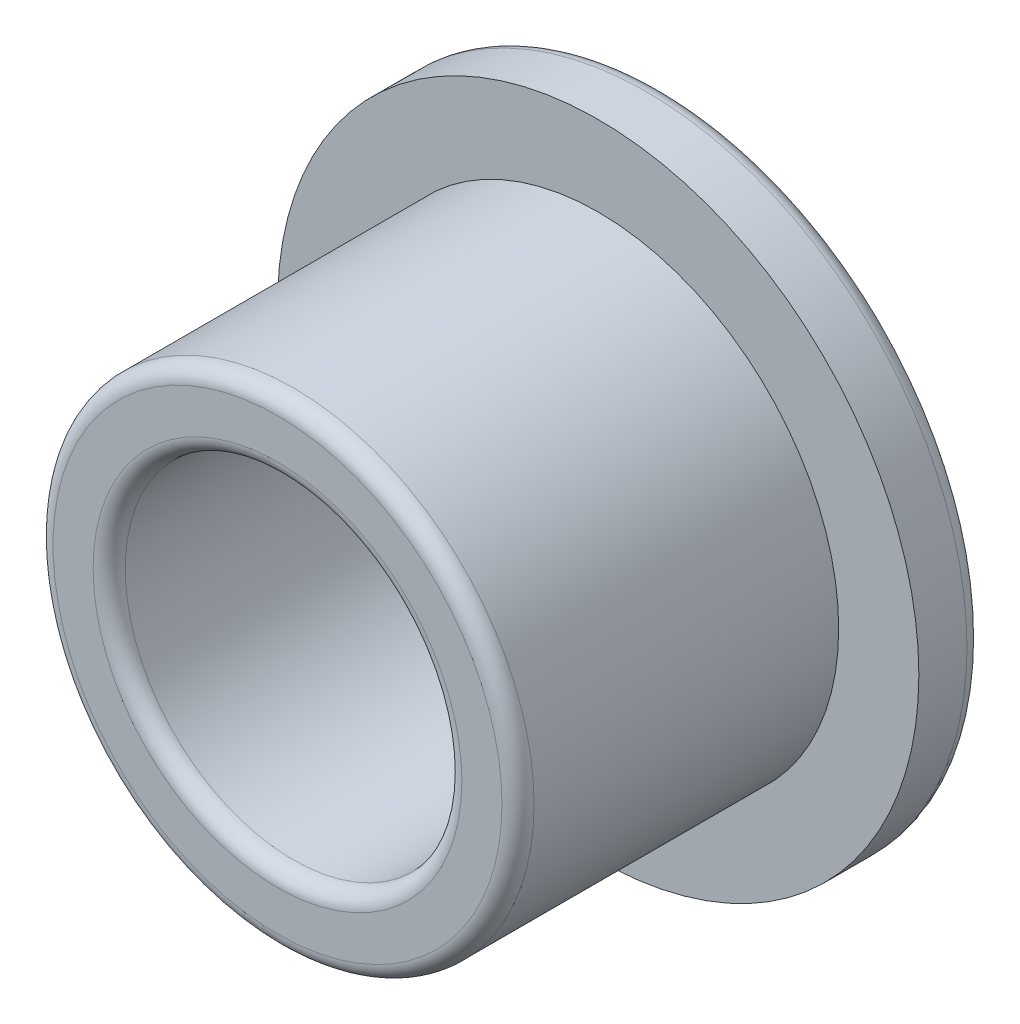
ISO-10303-21;
HEADER;
FILE_DESCRIPTION(('STEP AP214'),'2;1');
FILE_NAME('part.step','',(''),(''),'','','');
FILE_SCHEMA(('AUTOMOTIVE_DESIGN { 1 0 10303 214 1 1 1 1 }'));
ENDSEC;
DATA;
#1=APPLICATION_CONTEXT('core data for automotive mechanical design processes');
#2=APPLICATION_PROTOCOL_DEFINITION('international standard','automotive_design',2000,#1);
#3=PRODUCT_CONTEXT('',#1,'mechanical');
#4=PRODUCT('Part','Part','',(#3));
#5=PRODUCT_RELATED_PRODUCT_CATEGORY('part','',(#4));
#6=PRODUCT_DEFINITION_FORMATION('','',#4);
#7=PRODUCT_DEFINITION_CONTEXT('part definition',#1,'design');
#8=PRODUCT_DEFINITION('design','',#6,#7);
#9=PRODUCT_DEFINITION_SHAPE('','',#8);
#10=(LENGTH_UNIT() NAMED_UNIT(*) SI_UNIT(.MILLI.,.METRE.));
#11=(NAMED_UNIT(*) PLANE_ANGLE_UNIT() SI_UNIT($,.RADIAN.));
#12=(NAMED_UNIT(*) SI_UNIT($,.STERADIAN.) SOLID_ANGLE_UNIT());
#13=UNCERTAINTY_MEASURE_WITH_UNIT(LENGTH_MEASURE(1.E-05),#10,'distance_accuracy_value','');
#14=(GEOMETRIC_REPRESENTATION_CONTEXT(3) GLOBAL_UNCERTAINTY_ASSIGNED_CONTEXT((#13)) GLOBAL_UNIT_ASSIGNED_CONTEXT((#10,
#11,#12)) REPRESENTATION_CONTEXT('',''));
#15=CARTESIAN_POINT('',(0.,0.,0.));
#16=DIRECTION('',(0.,0.,1.));
#17=DIRECTION('',(1.,0.,0.));
#18=AXIS2_PLACEMENT_3D('',#15,#16,#17);
#19=CARTESIAN_POINT('',(0.,0.,10.));
#20=DIRECTION('',(0.,0.,-1.));
#21=DIRECTION('',(-1.,0.,0.));
#22=AXIS2_PLACEMENT_3D('',#19,#20,#21);
#23=CYLINDRICAL_SURFACE('',#22,5.25);
#24=CARTESIAN_POINT('',(0.,0.,9.5));
#25=DIRECTION('',(0.,0.,1.));
#26=DIRECTION('',(1.,0.,0.));
#27=AXIS2_PLACEMENT_3D('',#24,#25,#26);
#28=CIRCLE('',#27,5.25);
#29=CARTESIAN_POINT('',(5.25,0.,9.5));
#30=VERTEX_POINT('',#29);
#31=EDGE_CURVE('E47',#30,#30,#28,.T.);
#32=ORIENTED_EDGE('',*,*,#31,.T.);
#33=EDGE_LOOP('',(#32));
#34=FACE_BOUND('',#33,.T.);
#35=CARTESIAN_POINT('',(0.,0.,-1.5));
#36=DIRECTION('',(0.,0.,1.));
#37=DIRECTION('',(1.,0.,0.));
#38=AXIS2_PLACEMENT_3D('',#35,#36,#37);
#39=CIRCLE('',#38,5.25);
#40=CARTESIAN_POINT('',(5.25,0.,-1.5));
#41=VERTEX_POINT('',#40);
#42=EDGE_CURVE('E52',#41,#41,#39,.F.);
#43=ORIENTED_EDGE('',*,*,#42,.T.);
#44=EDGE_LOOP('',(#43));
#45=FACE_BOUND('',#44,.T.);
#46=ADVANCED_FACE('F32',(#34,#45),#23,.F.);
#47=CARTESIAN_POINT('',(0.,0.,10.));
#48=DIRECTION('',(0.,0.,-1.));
#49=DIRECTION('',(-1.,0.,0.));
#50=AXIS2_PLACEMENT_3D('',#47,#48,#49);
#51=CYLINDRICAL_SURFACE('',#50,7.5);
#52=CARTESIAN_POINT('',(0.,0.,9.5));
#53=DIRECTION('',(0.,0.,1.));
#54=DIRECTION('',(1.,0.,0.));
#55=AXIS2_PLACEMENT_3D('',#52,#53,#54);
#56=CIRCLE('',#55,7.5);
#57=CARTESIAN_POINT('',(7.5,0.,9.5));
#58=VERTEX_POINT('',#57);
#59=EDGE_CURVE('E55',#58,#58,#56,.F.);
#60=ORIENTED_EDGE('',*,*,#59,.T.);
#61=EDGE_LOOP('',(#60));
#62=FACE_BOUND('',#61,.T.);
#63=CARTESIAN_POINT('',(0.,0.,0.));
#64=DIRECTION('',(0.,0.,1.));
#65=DIRECTION('',(1.,0.,0.));
#66=AXIS2_PLACEMENT_3D('',#63,#64,#65);
#67=CIRCLE('',#66,7.5);
#68=CARTESIAN_POINT('',(7.5,0.,0.));
#69=VERTEX_POINT('',#68);
#70=EDGE_CURVE('E64',#69,#69,#67,.T.);
#71=ORIENTED_EDGE('',*,*,#70,.T.);
#72=EDGE_LOOP('',(#71));
#73=FACE_BOUND('',#72,.T.);
#74=ADVANCED_FACE('F83',(#62,#73),#51,.T.);
#75=CARTESIAN_POINT('',(0.,0.,10.));
#76=DIRECTION('',(0.,0.,1.));
#77=DIRECTION('',(1.,0.,0.));
#78=AXIS2_PLACEMENT_3D('',#75,#76,#77);
#79=PLANE('',#78);
#80=CARTESIAN_POINT('',(0.,0.,10.));
#81=DIRECTION('',(0.,0.,1.));
#82=DIRECTION('',(1.,0.,0.));
#83=AXIS2_PLACEMENT_3D('',#80,#81,#82);
#84=CIRCLE('',#83,7.);
#85=CARTESIAN_POINT('',(7.,0.,10.));
#86=VERTEX_POINT('',#85);
#87=EDGE_CURVE('E58',#86,#86,#84,.T.);
#88=ORIENTED_EDGE('',*,*,#87,.T.);
#89=EDGE_LOOP('',(#88));
#90=FACE_BOUND('',#89,.T.);
#91=CARTESIAN_POINT('',(0.,0.,10.));
#92=DIRECTION('',(0.,0.,1.));
#93=DIRECTION('',(1.,0.,0.));
#94=AXIS2_PLACEMENT_3D('',#91,#92,#93);
#95=CIRCLE('',#94,5.75);
#96=CARTESIAN_POINT('',(5.75,0.,10.));
#97=VERTEX_POINT('',#96);
#98=EDGE_CURVE('E61',#97,#97,#95,.F.);
#99=ORIENTED_EDGE('',*,*,#98,.T.);
#100=EDGE_LOOP('',(#99));
#101=FACE_BOUND('',#100,.T.);
#102=ADVANCED_FACE('F76',(#90,#101),#79,.T.);
#103=CARTESIAN_POINT('',(0.,0.,-2.));
#104=DIRECTION('',(0.,0.,1.));
#105=DIRECTION('',(1.,0.,0.));
#106=AXIS2_PLACEMENT_3D('',#103,#104,#105);
#107=CYLINDRICAL_SURFACE('',#106,10.);
#108=CARTESIAN_POINT('',(0.,0.,-1.5));
#109=DIRECTION('',(0.,0.,1.));
#110=DIRECTION('',(1.,0.,0.));
#111=AXIS2_PLACEMENT_3D('',#108,#109,#110);
#112=CIRCLE('',#111,10.);
#113=CARTESIAN_POINT('',(10.,0.,-1.5));
#114=VERTEX_POINT('',#113);
#115=EDGE_CURVE('E10',#114,#114,#112,.T.);
#116=ORIENTED_EDGE('',*,*,#115,.T.);
#117=EDGE_LOOP('',(#116));
#118=FACE_BOUND('',#117,.T.);
#119=CARTESIAN_POINT('',(0.,0.,0.));
#120=DIRECTION('',(0.,0.,1.));
#121=DIRECTION('',(1.,0.,0.));
#122=AXIS2_PLACEMENT_3D('',#119,#120,#121);
#123=CIRCLE('',#122,10.);
#124=CARTESIAN_POINT('',(10.,0.,0.));
#125=VERTEX_POINT('',#124);
#126=EDGE_CURVE('E67',#125,#125,#123,.T.);
#127=ORIENTED_EDGE('',*,*,#126,.F.);
#128=EDGE_LOOP('',(#127));
#129=FACE_BOUND('',#128,.T.);
#130=ADVANCED_FACE('F73',(#118,#129),#107,.T.);
#131=CARTESIAN_POINT('',(0.,0.,-2.));
#132=DIRECTION('',(0.,0.,1.));
#133=DIRECTION('',(1.,0.,0.));
#134=AXIS2_PLACEMENT_3D('',#131,#132,#133);
#135=PLANE('',#134);
#136=CARTESIAN_POINT('',(0.,0.,-2.));
#137=DIRECTION('',(0.,0.,1.));
#138=DIRECTION('',(1.,0.,0.));
#139=AXIS2_PLACEMENT_3D('',#136,#137,#138);
#140=CIRCLE('',#139,5.75);
#141=CARTESIAN_POINT('',(5.75,0.,-2.));
#142=VERTEX_POINT('',#141);
#143=EDGE_CURVE('E39',#142,#142,#140,.T.);
#144=ORIENTED_EDGE('',*,*,#143,.T.);
#145=EDGE_LOOP('',(#144));
#146=FACE_BOUND('',#145,.T.);
#147=CARTESIAN_POINT('',(0.,0.,-2.));
#148=DIRECTION('',(0.,0.,1.));
#149=DIRECTION('',(1.,0.,0.));
#150=AXIS2_PLACEMENT_3D('',#147,#148,#149);
#151=CIRCLE('',#150,9.5);
#152=CARTESIAN_POINT('',(9.5,0.,-2.));
#153=VERTEX_POINT('',#152);
#154=EDGE_CURVE('E43',#153,#153,#151,.F.);
#155=ORIENTED_EDGE('',*,*,#154,.T.);
#156=EDGE_LOOP('',(#155));
#157=FACE_BOUND('',#156,.T.);
#158=ADVANCED_FACE('F75',(#146,#157),#135,.F.);
#159=CARTESIAN_POINT('',(0.,0.,0.));
#160=DIRECTION('',(0.,0.,1.));
#161=DIRECTION('',(1.,0.,0.));
#162=AXIS2_PLACEMENT_3D('',#159,#160,#161);
#163=PLANE('',#162);
#164=ORIENTED_EDGE('',*,*,#70,.F.);
#165=EDGE_LOOP('',(#164));
#166=FACE_BOUND('',#165,.T.);
#167=ORIENTED_EDGE('',*,*,#126,.T.);
#168=EDGE_LOOP('',(#167));
#169=FACE_BOUND('',#168,.T.);
#170=ADVANCED_FACE('F71',(#166,#169),#163,.T.);
#171=CARTESIAN_POINT('',(0.,0.,9.5));
#172=DIRECTION('',(0.,0.,1.));
#173=DIRECTION('',(1.,0.,0.));
#174=AXIS2_PLACEMENT_3D('',#171,#172,#173);
#175=TOROIDAL_SURFACE('',#174,7.,0.5);
#176=ORIENTED_EDGE('',*,*,#59,.F.);
#177=EDGE_LOOP('',(#176));
#178=FACE_BOUND('',#177,.T.);
#179=ORIENTED_EDGE('',*,*,#87,.F.);
#180=EDGE_LOOP('',(#179));
#181=FACE_BOUND('',#180,.T.);
#182=ADVANCED_FACE('F97',(#178,#181),#175,.T.);
#183=CARTESIAN_POINT('',(0.,0.,9.5));
#184=DIRECTION('',(0.,0.,1.));
#185=DIRECTION('',(1.,0.,0.));
#186=AXIS2_PLACEMENT_3D('',#183,#184,#185);
#187=TOROIDAL_SURFACE('',#186,5.75,0.5);
#188=ORIENTED_EDGE('',*,*,#98,.F.);
#189=EDGE_LOOP('',(#188));
#190=FACE_BOUND('',#189,.T.);
#191=ORIENTED_EDGE('',*,*,#31,.F.);
#192=EDGE_LOOP('',(#191));
#193=FACE_BOUND('',#192,.T.);
#194=ADVANCED_FACE('F100',(#190,#193),#187,.T.);
#195=CARTESIAN_POINT('',(0.,0.,-1.5));
#196=DIRECTION('',(0.,0.,1.));
#197=DIRECTION('',(1.,0.,0.));
#198=AXIS2_PLACEMENT_3D('',#195,#196,#197);
#199=TOROIDAL_SURFACE('',#198,5.75,0.5);
#200=ORIENTED_EDGE('',*,*,#42,.F.);
#201=EDGE_LOOP('',(#200));
#202=FACE_BOUND('',#201,.T.);
#203=ORIENTED_EDGE('',*,*,#143,.F.);
#204=EDGE_LOOP('',(#203));
#205=FACE_BOUND('',#204,.T.);
#206=ADVANCED_FACE('F103',(#202,#205),#199,.T.);
#207=CARTESIAN_POINT('',(0.,0.,-1.5));
#208=DIRECTION('',(0.,0.,1.));
#209=DIRECTION('',(1.,0.,0.));
#210=AXIS2_PLACEMENT_3D('',#207,#208,#209);
#211=TOROIDAL_SURFACE('',#210,9.5,0.5);
#212=ORIENTED_EDGE('',*,*,#154,.F.);
#213=EDGE_LOOP('',(#212));
#214=FACE_BOUND('',#213,.T.);
#215=ORIENTED_EDGE('',*,*,#115,.F.);
#216=EDGE_LOOP('',(#215));
#217=FACE_BOUND('',#216,.T.);
#218=ADVANCED_FACE('F34',(#214,#217),#211,.T.);
#219=CLOSED_SHELL('',(#46,#74,#102,#130,#158,#170,#182,#194,#206,#218));
#220=MANIFOLD_SOLID_BREP('B2',#219);
#221=ADVANCED_BREP_SHAPE_REPRESENTATION('',(#18,#220),#14);
#222=SHAPE_DEFINITION_REPRESENTATION(#9,#221);
ENDSEC;
END-ISO-10303-21;
